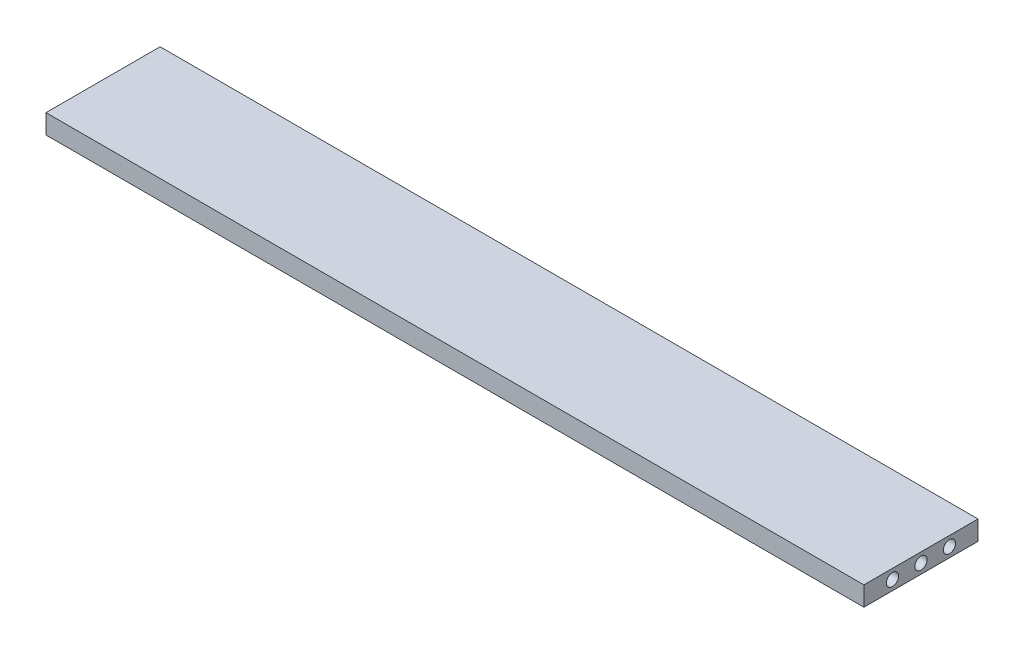
ISO-10303-21;
HEADER;
FILE_DESCRIPTION(('STEP AP214'),'2;1');
FILE_NAME('part.step','',(''),(''),'','','');
FILE_SCHEMA(('AUTOMOTIVE_DESIGN { 1 0 10303 214 1 1 1 1 }'));
ENDSEC;
DATA;
#1=APPLICATION_CONTEXT('core data for automotive mechanical design processes');
#2=APPLICATION_PROTOCOL_DEFINITION('international standard','automotive_design',2000,#1);
#3=PRODUCT_CONTEXT('',#1,'mechanical');
#4=PRODUCT('Part','Part','',(#3));
#5=PRODUCT_RELATED_PRODUCT_CATEGORY('part','',(#4));
#6=PRODUCT_DEFINITION_FORMATION('','',#4);
#7=PRODUCT_DEFINITION_CONTEXT('part definition',#1,'design');
#8=PRODUCT_DEFINITION('design','',#6,#7);
#9=PRODUCT_DEFINITION_SHAPE('','',#8);
#10=(LENGTH_UNIT() NAMED_UNIT(*) SI_UNIT(.MILLI.,.METRE.));
#11=(NAMED_UNIT(*) PLANE_ANGLE_UNIT() SI_UNIT($,.RADIAN.));
#12=(NAMED_UNIT(*) SI_UNIT($,.STERADIAN.) SOLID_ANGLE_UNIT());
#13=UNCERTAINTY_MEASURE_WITH_UNIT(LENGTH_MEASURE(1.E-05),#10,'distance_accuracy_value','');
#14=(GEOMETRIC_REPRESENTATION_CONTEXT(3) GLOBAL_UNCERTAINTY_ASSIGNED_CONTEXT((#13)) GLOBAL_UNIT_ASSIGNED_CONTEXT((#10,
#11,#12)) REPRESENTATION_CONTEXT('',''));
#15=CARTESIAN_POINT('',(0.,0.,0.));
#16=DIRECTION('',(0.,0.,1.));
#17=DIRECTION('',(1.,0.,0.));
#18=AXIS2_PLACEMENT_3D('',#15,#16,#17);
#19=CARTESIAN_POINT('',(-200.715,9.525,-28.));
#20=DIRECTION('',(1.,0.,0.));
#21=DIRECTION('',(0.,0.,-1.));
#22=AXIS2_PLACEMENT_3D('',#19,#20,#21);
#23=PLANE('',#22);
#24=CARTESIAN_POINT('',(-200.715,4.76,-14.00000000001));
#25=DIRECTION('',(-1.,0.,0.));
#26=DIRECTION('',(0.,0.,1.));
#27=AXIS2_PLACEMENT_3D('',#24,#25,#26);
#28=CIRCLE('',#27,3.);
#29=CARTESIAN_POINT('',(-200.715,4.76,-11.00000000001));
#30=VERTEX_POINT('',#29);
#31=EDGE_CURVE('E120',#30,#30,#28,.T.);
#32=ORIENTED_EDGE('',*,*,#31,.F.);
#33=EDGE_LOOP('',(#32));
#34=FACE_BOUND('',#33,.T.);
#35=CARTESIAN_POINT('',(-200.715,4.76,-9.98853777467446E-12));
#36=DIRECTION('',(-1.,0.,0.));
#37=DIRECTION('',(0.,0.,1.));
#38=AXIS2_PLACEMENT_3D('',#35,#36,#37);
#39=CIRCLE('',#38,3.);
#40=CARTESIAN_POINT('',(-200.715,4.76,2.99999999999001));
#41=VERTEX_POINT('',#40);
#42=EDGE_CURVE('E114',#41,#41,#39,.T.);
#43=ORIENTED_EDGE('',*,*,#42,.F.);
#44=EDGE_LOOP('',(#43));
#45=FACE_BOUND('',#44,.T.);
#46=CARTESIAN_POINT('',(-200.715,4.76,13.99999999999));
#47=DIRECTION('',(-1.,0.,0.));
#48=DIRECTION('',(0.,0.,1.));
#49=AXIS2_PLACEMENT_3D('',#46,#47,#48);
#50=CIRCLE('',#49,3.);
#51=CARTESIAN_POINT('',(-200.715,4.76,16.99999999999));
#52=VERTEX_POINT('',#51);
#53=EDGE_CURVE('E108',#52,#52,#50,.T.);
#54=ORIENTED_EDGE('',*,*,#53,.F.);
#55=EDGE_LOOP('',(#54));
#56=FACE_BOUND('',#55,.T.);
#57=DIRECTION('',(0.,0.,1.));
#58=VECTOR('',#57,1.);
#59=CARTESIAN_POINT('',(-200.715,0.,-28.));
#60=LINE('',#59,#58);
#61=CARTESIAN_POINT('',(-200.715,0.,-28.));
#62=VERTEX_POINT('',#61);
#63=CARTESIAN_POINT('',(-200.715,0.,28.));
#64=VERTEX_POINT('',#63);
#65=EDGE_CURVE('E94',#62,#64,#60,.T.);
#66=ORIENTED_EDGE('',*,*,#65,.T.);
#67=DIRECTION('',(0.,-1.,0.));
#68=VECTOR('',#67,1.);
#69=CARTESIAN_POINT('',(-200.715,9.525,28.));
#70=LINE('',#69,#68);
#71=CARTESIAN_POINT('',(-200.715,9.525,28.));
#72=VERTEX_POINT('',#71);
#73=EDGE_CURVE('E11',#72,#64,#70,.T.);
#74=ORIENTED_EDGE('',*,*,#73,.F.);
#75=DIRECTION('',(0.,0.,1.));
#76=VECTOR('',#75,1.);
#77=CARTESIAN_POINT('',(-200.715,9.525,-28.));
#78=LINE('',#77,#76);
#79=CARTESIAN_POINT('',(-200.715,9.525,-28.));
#80=VERTEX_POINT('',#79);
#81=EDGE_CURVE('E82',#80,#72,#78,.T.);
#82=ORIENTED_EDGE('',*,*,#81,.F.);
#83=DIRECTION('',(0.,-1.,0.));
#84=VECTOR('',#83,1.);
#85=CARTESIAN_POINT('',(-200.715,9.525,-28.));
#86=LINE('',#85,#84);
#87=EDGE_CURVE('E90',#80,#62,#86,.T.);
#88=ORIENTED_EDGE('',*,*,#87,.T.);
#89=EDGE_LOOP('',(#66,#74,#82,#88));
#90=FACE_BOUND('',#89,.T.);
#91=ADVANCED_FACE('F31',(#34,#45,#56,#90),#23,.F.);
#92=CARTESIAN_POINT('',(-200.715,9.525,28.));
#93=DIRECTION('',(0.,0.,-1.));
#94=DIRECTION('',(-1.,0.,0.));
#95=AXIS2_PLACEMENT_3D('',#92,#93,#94);
#96=PLANE('',#95);
#97=DIRECTION('',(1.,0.,0.));
#98=VECTOR('',#97,1.);
#99=CARTESIAN_POINT('',(-200.715,0.,28.));
#100=LINE('',#99,#98);
#101=CARTESIAN_POINT('',(200.715,0.,28.));
#102=VERTEX_POINT('',#101);
#103=EDGE_CURVE('E86',#64,#102,#100,.T.);
#104=ORIENTED_EDGE('',*,*,#103,.T.);
#105=DIRECTION('',(0.,-1.,0.));
#106=VECTOR('',#105,1.);
#107=CARTESIAN_POINT('',(200.715,9.525,28.));
#108=LINE('',#107,#106);
#109=CARTESIAN_POINT('',(200.715,9.525,28.));
#110=VERTEX_POINT('',#109);
#111=EDGE_CURVE('E39',#110,#102,#108,.T.);
#112=ORIENTED_EDGE('',*,*,#111,.F.);
#113=DIRECTION('',(1.,0.,0.));
#114=VECTOR('',#113,1.);
#115=CARTESIAN_POINT('',(-200.715,9.525,28.));
#116=LINE('',#115,#114);
#117=EDGE_CURVE('E77',#72,#110,#116,.T.);
#118=ORIENTED_EDGE('',*,*,#117,.F.);
#119=ORIENTED_EDGE('',*,*,#73,.T.);
#120=EDGE_LOOP('',(#104,#112,#118,#119));
#121=FACE_BOUND('',#120,.T.);
#122=ADVANCED_FACE('F85',(#121),#96,.F.);
#123=CARTESIAN_POINT('',(200.715,9.525,-28.));
#124=DIRECTION('',(-1.,0.,0.));
#125=DIRECTION('',(0.,0.,1.));
#126=AXIS2_PLACEMENT_3D('',#123,#124,#125);
#127=PLANE('',#126);
#128=CARTESIAN_POINT('',(200.715,4.765,13.99999999999));
#129=DIRECTION('',(1.,0.,0.));
#130=DIRECTION('',(0.,0.,-1.));
#131=AXIS2_PLACEMENT_3D('',#128,#129,#130);
#132=CIRCLE('',#131,3.);
#133=CARTESIAN_POINT('',(200.715,4.765,10.99999999999));
#134=VERTEX_POINT('',#133);
#135=EDGE_CURVE('E138',#134,#134,#132,.T.);
#136=ORIENTED_EDGE('',*,*,#135,.F.);
#137=EDGE_LOOP('',(#136));
#138=FACE_BOUND('',#137,.T.);
#139=CARTESIAN_POINT('',(200.715,4.765,-1.0019762797242E-11));
#140=DIRECTION('',(1.,0.,0.));
#141=DIRECTION('',(0.,0.,-1.));
#142=AXIS2_PLACEMENT_3D('',#139,#140,#141);
#143=CIRCLE('',#142,3.);
#144=CARTESIAN_POINT('',(200.715,4.765,-3.00000000001002));
#145=VERTEX_POINT('',#144);
#146=EDGE_CURVE('E132',#145,#145,#143,.T.);
#147=ORIENTED_EDGE('',*,*,#146,.F.);
#148=EDGE_LOOP('',(#147));
#149=FACE_BOUND('',#148,.T.);
#150=CARTESIAN_POINT('',(200.715,4.765,-14.00000000001));
#151=DIRECTION('',(1.,0.,0.));
#152=DIRECTION('',(0.,0.,-1.));
#153=AXIS2_PLACEMENT_3D('',#150,#151,#152);
#154=CIRCLE('',#153,3.);
#155=CARTESIAN_POINT('',(200.715,4.765,-17.00000000001));
#156=VERTEX_POINT('',#155);
#157=EDGE_CURVE('E126',#156,#156,#154,.T.);
#158=ORIENTED_EDGE('',*,*,#157,.F.);
#159=EDGE_LOOP('',(#158));
#160=FACE_BOUND('',#159,.T.);
#161=DIRECTION('',(0.,0.,-1.));
#162=VECTOR('',#161,1.);
#163=CARTESIAN_POINT('',(200.715,0.,-28.));
#164=LINE('',#163,#162);
#165=CARTESIAN_POINT('',(200.715,0.,-28.));
#166=VERTEX_POINT('',#165);
#167=EDGE_CURVE('E64',#102,#166,#164,.T.);
#168=ORIENTED_EDGE('',*,*,#167,.T.);
#169=DIRECTION('',(0.,-1.,0.));
#170=VECTOR('',#169,1.);
#171=CARTESIAN_POINT('',(200.715,9.525,-28.));
#172=LINE('',#171,#170);
#173=CARTESIAN_POINT('',(200.715,9.525,-28.));
#174=VERTEX_POINT('',#173);
#175=EDGE_CURVE('E87',#174,#166,#172,.T.);
#176=ORIENTED_EDGE('',*,*,#175,.F.);
#177=DIRECTION('',(0.,0.,-1.));
#178=VECTOR('',#177,1.);
#179=CARTESIAN_POINT('',(200.715,9.525,-28.));
#180=LINE('',#179,#178);
#181=EDGE_CURVE('E80',#110,#174,#180,.T.);
#182=ORIENTED_EDGE('',*,*,#181,.F.);
#183=ORIENTED_EDGE('',*,*,#111,.T.);
#184=EDGE_LOOP('',(#168,#176,#182,#183));
#185=FACE_BOUND('',#184,.T.);
#186=ADVANCED_FACE('F88',(#138,#149,#160,#185),#127,.F.);
#187=CARTESIAN_POINT('',(-200.715,9.525,-28.));
#188=DIRECTION('',(0.,0.,1.));
#189=DIRECTION('',(1.,0.,0.));
#190=AXIS2_PLACEMENT_3D('',#187,#188,#189);
#191=PLANE('',#190);
#192=DIRECTION('',(-1.,0.,0.));
#193=VECTOR('',#192,1.);
#194=CARTESIAN_POINT('',(-200.715,0.,-28.));
#195=LINE('',#194,#193);
#196=EDGE_CURVE('E70',#166,#62,#195,.T.);
#197=ORIENTED_EDGE('',*,*,#196,.T.);
#198=ORIENTED_EDGE('',*,*,#87,.F.);
#199=DIRECTION('',(-1.,0.,0.));
#200=VECTOR('',#199,1.);
#201=CARTESIAN_POINT('',(-200.715,9.525,-28.));
#202=LINE('',#201,#200);
#203=EDGE_CURVE('E47',#174,#80,#202,.T.);
#204=ORIENTED_EDGE('',*,*,#203,.F.);
#205=ORIENTED_EDGE('',*,*,#175,.T.);
#206=EDGE_LOOP('',(#197,#198,#204,#205));
#207=FACE_BOUND('',#206,.T.);
#208=ADVANCED_FACE('F102',(#207),#191,.F.);
#209=CARTESIAN_POINT('',(-200.715,9.525,28.));
#210=DIRECTION('',(0.,1.,0.));
#211=DIRECTION('',(0.,0.,1.));
#212=AXIS2_PLACEMENT_3D('',#209,#210,#211);
#213=PLANE('',#212);
#214=ORIENTED_EDGE('',*,*,#81,.T.);
#215=ORIENTED_EDGE('',*,*,#117,.T.);
#216=ORIENTED_EDGE('',*,*,#181,.T.);
#217=ORIENTED_EDGE('',*,*,#203,.T.);
#218=EDGE_LOOP('',(#214,#215,#216,#217));
#219=FACE_BOUND('',#218,.T.);
#220=ADVANCED_FACE('F78',(#219),#213,.T.);
#221=CARTESIAN_POINT('',(-200.715,0.,28.));
#222=DIRECTION('',(0.,1.,0.));
#223=DIRECTION('',(0.,0.,1.));
#224=AXIS2_PLACEMENT_3D('',#221,#222,#223);
#225=PLANE('',#224);
#226=ORIENTED_EDGE('',*,*,#65,.F.);
#227=ORIENTED_EDGE('',*,*,#196,.F.);
#228=ORIENTED_EDGE('',*,*,#167,.F.);
#229=ORIENTED_EDGE('',*,*,#103,.F.);
#230=EDGE_LOOP('',(#226,#227,#228,#229));
#231=FACE_BOUND('',#230,.T.);
#232=ADVANCED_FACE('F105',(#231),#225,.F.);
#233=CARTESIAN_POINT('',(-170.715,4.76,13.99999999999));
#234=DIRECTION('',(-1.,0.,0.));
#235=DIRECTION('',(0.,0.,1.));
#236=AXIS2_PLACEMENT_3D('',#233,#234,#235);
#237=CYLINDRICAL_SURFACE('',#236,3.);
#238=CARTESIAN_POINT('',(-170.715,4.76,13.99999999999));
#239=DIRECTION('',(-1.,0.,0.));
#240=DIRECTION('',(0.,0.,1.));
#241=AXIS2_PLACEMENT_3D('',#238,#239,#240);
#242=CIRCLE('',#241,3.);
#243=CARTESIAN_POINT('',(-170.715,4.76,16.99999999999));
#244=VERTEX_POINT('',#243);
#245=EDGE_CURVE('E97',#244,#244,#242,.T.);
#246=ORIENTED_EDGE('',*,*,#245,.F.);
#247=EDGE_LOOP('',(#246));
#248=FACE_BOUND('',#247,.T.);
#249=ORIENTED_EDGE('',*,*,#53,.T.);
#250=EDGE_LOOP('',(#249));
#251=FACE_BOUND('',#250,.T.);
#252=ADVANCED_FACE('F188',(#248,#251),#237,.F.);
#253=CARTESIAN_POINT('',(-170.715,4.76,13.99999999999));
#254=DIRECTION('',(-1.,0.,0.));
#255=DIRECTION('',(0.,0.,1.));
#256=AXIS2_PLACEMENT_3D('',#253,#254,#255);
#257=PLANE('',#256);
#258=ORIENTED_EDGE('',*,*,#245,.T.);
#259=EDGE_LOOP('',(#258));
#260=FACE_BOUND('',#259,.T.);
#261=ADVANCED_FACE('F190',(#260),#257,.T.);
#262=CARTESIAN_POINT('',(-170.715,4.76,-9.98853777467446E-12));
#263=DIRECTION('',(-1.,0.,0.));
#264=DIRECTION('',(0.,0.,1.));
#265=AXIS2_PLACEMENT_3D('',#262,#263,#264);
#266=CYLINDRICAL_SURFACE('',#265,3.);
#267=CARTESIAN_POINT('',(-170.715,4.76,-9.98853777467446E-12));
#268=DIRECTION('',(-1.,0.,0.));
#269=DIRECTION('',(0.,0.,1.));
#270=AXIS2_PLACEMENT_3D('',#267,#268,#269);
#271=CIRCLE('',#270,3.);
#272=CARTESIAN_POINT('',(-170.715,4.76,2.99999999999001));
#273=VERTEX_POINT('',#272);
#274=EDGE_CURVE('E111',#273,#273,#271,.T.);
#275=ORIENTED_EDGE('',*,*,#274,.F.);
#276=EDGE_LOOP('',(#275));
#277=FACE_BOUND('',#276,.T.);
#278=ORIENTED_EDGE('',*,*,#42,.T.);
#279=EDGE_LOOP('',(#278));
#280=FACE_BOUND('',#279,.T.);
#281=ADVANCED_FACE('F197',(#277,#280),#266,.F.);
#282=CARTESIAN_POINT('',(-170.715,4.76,-9.98853777467446E-12));
#283=DIRECTION('',(-1.,0.,0.));
#284=DIRECTION('',(0.,0.,1.));
#285=AXIS2_PLACEMENT_3D('',#282,#283,#284);
#286=PLANE('',#285);
#287=ORIENTED_EDGE('',*,*,#274,.T.);
#288=EDGE_LOOP('',(#287));
#289=FACE_BOUND('',#288,.T.);
#290=ADVANCED_FACE('F244',(#289),#286,.T.);
#291=CARTESIAN_POINT('',(-170.715,4.76,-14.00000000001));
#292=DIRECTION('',(-1.,0.,0.));
#293=DIRECTION('',(0.,0.,1.));
#294=AXIS2_PLACEMENT_3D('',#291,#292,#293);
#295=CYLINDRICAL_SURFACE('',#294,3.);
#296=CARTESIAN_POINT('',(-170.715,4.76,-14.00000000001));
#297=DIRECTION('',(-1.,0.,0.));
#298=DIRECTION('',(0.,0.,1.));
#299=AXIS2_PLACEMENT_3D('',#296,#297,#298);
#300=CIRCLE('',#299,3.);
#301=CARTESIAN_POINT('',(-170.715,4.76,-11.00000000001));
#302=VERTEX_POINT('',#301);
#303=EDGE_CURVE('E117',#302,#302,#300,.T.);
#304=ORIENTED_EDGE('',*,*,#303,.F.);
#305=EDGE_LOOP('',(#304));
#306=FACE_BOUND('',#305,.T.);
#307=ORIENTED_EDGE('',*,*,#31,.T.);
#308=EDGE_LOOP('',(#307));
#309=FACE_BOUND('',#308,.T.);
#310=ADVANCED_FACE('F173',(#306,#309),#295,.F.);
#311=CARTESIAN_POINT('',(-170.715,4.76,-14.00000000001));
#312=DIRECTION('',(-1.,0.,0.));
#313=DIRECTION('',(0.,0.,1.));
#314=AXIS2_PLACEMENT_3D('',#311,#312,#313);
#315=PLANE('',#314);
#316=ORIENTED_EDGE('',*,*,#303,.T.);
#317=EDGE_LOOP('',(#316));
#318=FACE_BOUND('',#317,.T.);
#319=ADVANCED_FACE('F163',(#318),#315,.T.);
#320=CARTESIAN_POINT('',(170.715,4.765,-14.00000000001));
#321=DIRECTION('',(1.,0.,0.));
#322=DIRECTION('',(0.,0.,-1.));
#323=AXIS2_PLACEMENT_3D('',#320,#321,#322);
#324=CYLINDRICAL_SURFACE('',#323,3.);
#325=CARTESIAN_POINT('',(170.715,4.765,-14.00000000001));
#326=DIRECTION('',(1.,0.,0.));
#327=DIRECTION('',(0.,0.,-1.));
#328=AXIS2_PLACEMENT_3D('',#325,#326,#327);
#329=CIRCLE('',#328,3.);
#330=CARTESIAN_POINT('',(170.715,4.765,-17.00000000001));
#331=VERTEX_POINT('',#330);
#332=EDGE_CURVE('E123',#331,#331,#329,.T.);
#333=ORIENTED_EDGE('',*,*,#332,.F.);
#334=EDGE_LOOP('',(#333));
#335=FACE_BOUND('',#334,.T.);
#336=ORIENTED_EDGE('',*,*,#157,.T.);
#337=EDGE_LOOP('',(#336));
#338=FACE_BOUND('',#337,.T.);
#339=ADVANCED_FACE('F160',(#335,#338),#324,.F.);
#340=CARTESIAN_POINT('',(170.715,4.765,-14.00000000001));
#341=DIRECTION('',(1.,0.,0.));
#342=DIRECTION('',(0.,0.,-1.));
#343=AXIS2_PLACEMENT_3D('',#340,#341,#342);
#344=PLANE('',#343);
#345=ORIENTED_EDGE('',*,*,#332,.T.);
#346=EDGE_LOOP('',(#345));
#347=FACE_BOUND('',#346,.T.);
#348=ADVANCED_FACE('F162',(#347),#344,.T.);
#349=CARTESIAN_POINT('',(170.715,4.765,-1.0019762797242E-11));
#350=DIRECTION('',(1.,0.,0.));
#351=DIRECTION('',(0.,0.,-1.));
#352=AXIS2_PLACEMENT_3D('',#349,#350,#351);
#353=CYLINDRICAL_SURFACE('',#352,3.);
#354=CARTESIAN_POINT('',(170.715,4.765,-1.0019762797242E-11));
#355=DIRECTION('',(1.,0.,0.));
#356=DIRECTION('',(0.,0.,-1.));
#357=AXIS2_PLACEMENT_3D('',#354,#355,#356);
#358=CIRCLE('',#357,3.);
#359=CARTESIAN_POINT('',(170.715,4.765,-3.00000000001002));
#360=VERTEX_POINT('',#359);
#361=EDGE_CURVE('E129',#360,#360,#358,.T.);
#362=ORIENTED_EDGE('',*,*,#361,.F.);
#363=EDGE_LOOP('',(#362));
#364=FACE_BOUND('',#363,.T.);
#365=ORIENTED_EDGE('',*,*,#146,.T.);
#366=EDGE_LOOP('',(#365));
#367=FACE_BOUND('',#366,.T.);
#368=ADVANCED_FACE('F170',(#364,#367),#353,.F.);
#369=CARTESIAN_POINT('',(170.715,4.765,-1.0019762797242E-11));
#370=DIRECTION('',(1.,0.,0.));
#371=DIRECTION('',(0.,0.,-1.));
#372=AXIS2_PLACEMENT_3D('',#369,#370,#371);
#373=PLANE('',#372);
#374=ORIENTED_EDGE('',*,*,#361,.T.);
#375=EDGE_LOOP('',(#374));
#376=FACE_BOUND('',#375,.T.);
#377=ADVANCED_FACE('F149',(#376),#373,.T.);
#378=CARTESIAN_POINT('',(170.715,4.765,13.99999999999));
#379=DIRECTION('',(1.,0.,0.));
#380=DIRECTION('',(0.,0.,-1.));
#381=AXIS2_PLACEMENT_3D('',#378,#379,#380);
#382=CYLINDRICAL_SURFACE('',#381,3.);
#383=CARTESIAN_POINT('',(170.715,4.765,13.99999999999));
#384=DIRECTION('',(1.,0.,0.));
#385=DIRECTION('',(0.,0.,-1.));
#386=AXIS2_PLACEMENT_3D('',#383,#384,#385);
#387=CIRCLE('',#386,3.);
#388=CARTESIAN_POINT('',(170.715,4.765,10.99999999999));
#389=VERTEX_POINT('',#388);
#390=EDGE_CURVE('E135',#389,#389,#387,.T.);
#391=ORIENTED_EDGE('',*,*,#390,.F.);
#392=EDGE_LOOP('',(#391));
#393=FACE_BOUND('',#392,.T.);
#394=ORIENTED_EDGE('',*,*,#135,.T.);
#395=EDGE_LOOP('',(#394));
#396=FACE_BOUND('',#395,.T.);
#397=ADVANCED_FACE('F146',(#393,#396),#382,.F.);
#398=CARTESIAN_POINT('',(170.715,4.765,13.99999999999));
#399=DIRECTION('',(1.,0.,0.));
#400=DIRECTION('',(0.,0.,-1.));
#401=AXIS2_PLACEMENT_3D('',#398,#399,#400);
#402=PLANE('',#401);
#403=ORIENTED_EDGE('',*,*,#390,.T.);
#404=EDGE_LOOP('',(#403));
#405=FACE_BOUND('',#404,.T.);
#406=ADVANCED_FACE('F144',(#405),#402,.T.);
#407=CLOSED_SHELL('',(#91,#122,#186,#208,#220,#232,#252,#261,#281,#290,#310,#319,#339,#348,#368,
#377,#397,#406));
#408=MANIFOLD_SOLID_BREP('B2',#407);
#409=ADVANCED_BREP_SHAPE_REPRESENTATION('',(#18,#408),#14);
#410=SHAPE_DEFINITION_REPRESENTATION(#9,#409);
ENDSEC;
END-ISO-10303-21;
